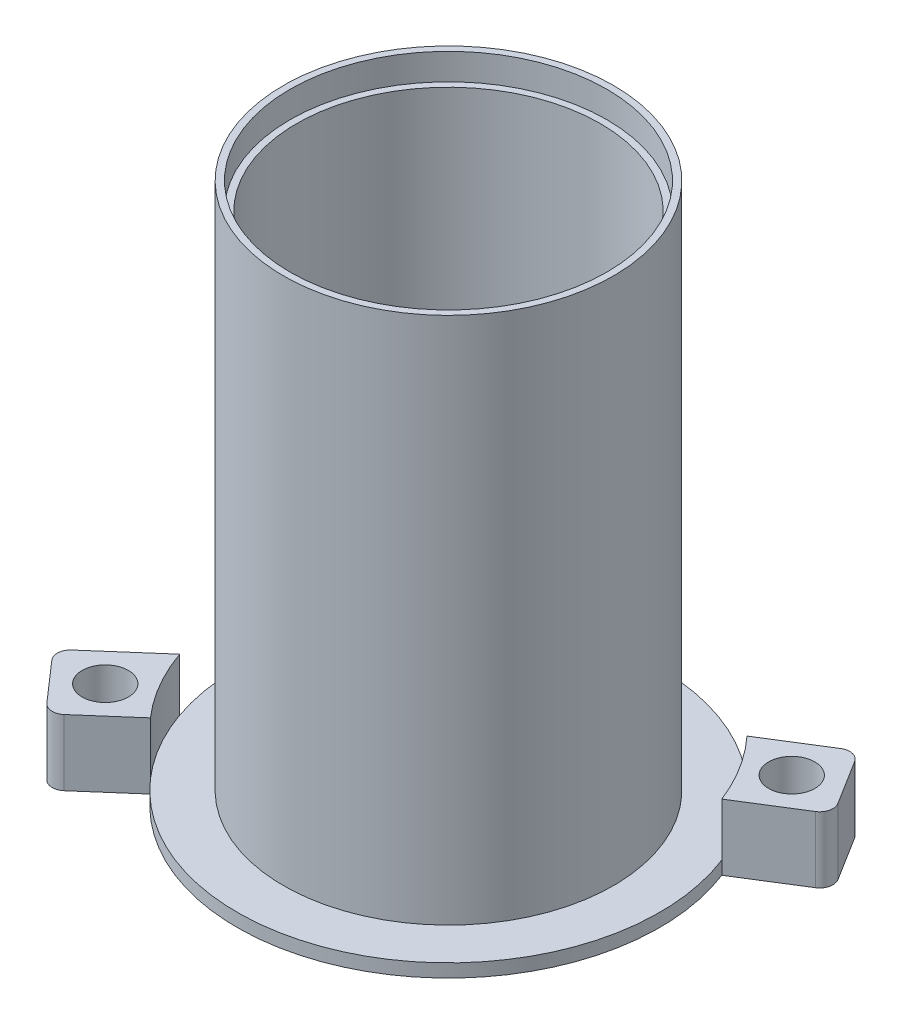
ISO-10303-21;
HEADER;
FILE_DESCRIPTION(('STEP AP214'),'2;1');
FILE_NAME('part.step','',(''),(''),'','','');
FILE_SCHEMA(('AUTOMOTIVE_DESIGN { 1 0 10303 214 1 1 1 1 }'));
ENDSEC;
DATA;
#1=APPLICATION_CONTEXT('core data for automotive mechanical design processes');
#2=APPLICATION_PROTOCOL_DEFINITION('international standard','automotive_design',2000,#1);
#3=PRODUCT_CONTEXT('',#1,'mechanical');
#4=PRODUCT('Part','Part','',(#3));
#5=PRODUCT_RELATED_PRODUCT_CATEGORY('part','',(#4));
#6=PRODUCT_DEFINITION_FORMATION('','',#4);
#7=PRODUCT_DEFINITION_CONTEXT('part definition',#1,'design');
#8=PRODUCT_DEFINITION('design','',#6,#7);
#9=PRODUCT_DEFINITION_SHAPE('','',#8);
#10=(LENGTH_UNIT() NAMED_UNIT(*) SI_UNIT(.MILLI.,.METRE.));
#11=(NAMED_UNIT(*) PLANE_ANGLE_UNIT() SI_UNIT($,.RADIAN.));
#12=(NAMED_UNIT(*) SI_UNIT($,.STERADIAN.) SOLID_ANGLE_UNIT());
#13=UNCERTAINTY_MEASURE_WITH_UNIT(LENGTH_MEASURE(1.E-05),#10,'distance_accuracy_value','');
#14=(GEOMETRIC_REPRESENTATION_CONTEXT(3) GLOBAL_UNCERTAINTY_ASSIGNED_CONTEXT((#13)) GLOBAL_UNIT_ASSIGNED_CONTEXT((#10,
#11,#12)) REPRESENTATION_CONTEXT('',''));
#15=CARTESIAN_POINT('',(0.,0.,0.));
#16=DIRECTION('',(0.,0.,1.));
#17=DIRECTION('',(1.,0.,0.));
#18=AXIS2_PLACEMENT_3D('',#15,#16,#17);
#19=CARTESIAN_POINT('',(0.,0.,0.));
#20=DIRECTION('',(0.,-1.,0.));
#21=DIRECTION('',(0.,0.,-1.));
#22=AXIS2_PLACEMENT_3D('',#19,#20,#21);
#23=CYLINDRICAL_SURFACE('',#22,16.);
#24=DIRECTION('',(0.,-1.,0.));
#25=VECTOR('',#24,1.);
#26=CARTESIAN_POINT('',(11.7373426567236,5.,-10.8735820849735));
#27=LINE('',#26,#25);
#28=CARTESIAN_POINT('',(11.7373426567236,0.999999999999999,-10.8735820849735));
#29=VERTEX_POINT('',#28);
#30=CARTESIAN_POINT('',(11.7373426567236,0.,-10.8735820849735));
#31=VERTEX_POINT('',#30);
#32=EDGE_CURVE('E164',#29,#31,#27,.T.);
#33=ORIENTED_EDGE('',*,*,#32,.T.);
#34=CARTESIAN_POINT('',(0.,0.,0.));
#35=DIRECTION('',(0.,-1.,0.));
#36=DIRECTION('',(0.,0.,-1.));
#37=AXIS2_PLACEMENT_3D('',#34,#35,#36);
#38=CIRCLE('',#37,16.);
#39=CARTESIAN_POINT('',(-15.116447524706,0.,5.24337813177819));
#40=VERTEX_POINT('',#39);
#41=EDGE_CURVE('E242',#40,#31,#38,.T.);
#42=ORIENTED_EDGE('',*,*,#41,.F.);
#43=DIRECTION('',(0.,-1.,0.));
#44=VECTOR('',#43,1.);
#45=CARTESIAN_POINT('',(-15.116447524706,5.,5.24337813177819));
#46=LINE('',#45,#44);
#47=CARTESIAN_POINT('',(-15.116447524706,0.999999999999999,5.24337813177819));
#48=VERTEX_POINT('',#47);
#49=EDGE_CURVE('E204',#48,#40,#46,.T.);
#50=ORIENTED_EDGE('',*,*,#49,.F.);
#51=CARTESIAN_POINT('',(0.,0.999999999999999,0.));
#52=DIRECTION('',(0.,-1.,0.));
#53=DIRECTION('',(0.,0.,-1.));
#54=AXIS2_PLACEMENT_3D('',#51,#52,#53);
#55=CIRCLE('',#54,16.);
#56=EDGE_CURVE('E241',#48,#29,#55,.T.);
#57=ORIENTED_EDGE('',*,*,#56,.T.);
#58=EDGE_LOOP('',(#33,#42,#50,#57));
#59=FACE_BOUND('',#58,.T.);
#60=ADVANCED_FACE('F43',(#59),#23,.T.);
#61=DIRECTION('',(0.,-1.,0.));
#62=VECTOR('',#61,1.);
#63=CARTESIAN_POINT('',(14.9173362967427,5.,-5.78559226094295));
#64=LINE('',#63,#62);
#65=CARTESIAN_POINT('',(14.9173362967427,0.999999999999999,-5.78559226094295));
#66=VERTEX_POINT('',#65);
#67=CARTESIAN_POINT('',(14.9173362967427,0.,-5.78559226094295));
#68=VERTEX_POINT('',#67);
#69=EDGE_CURVE('E155',#66,#68,#64,.T.);
#70=ORIENTED_EDGE('',*,*,#69,.F.);
#71=CARTESIAN_POINT('',(-12.0470551084564,0.999999999999999,10.5294094427852));
#72=VERTEX_POINT('',#71);
#73=EDGE_CURVE('E236',#66,#72,#55,.T.);
#74=ORIENTED_EDGE('',*,*,#73,.T.);
#75=DIRECTION('',(0.,-1.,0.));
#76=VECTOR('',#75,1.);
#77=CARTESIAN_POINT('',(-12.0470551084564,5.,10.5294094427852));
#78=LINE('',#77,#76);
#79=CARTESIAN_POINT('',(-12.0470551084564,0.,10.5294094427852));
#80=VERTEX_POINT('',#79);
#81=EDGE_CURVE('E218',#72,#80,#78,.T.);
#82=ORIENTED_EDGE('',*,*,#81,.T.);
#83=EDGE_CURVE('E240',#68,#80,#38,.T.);
#84=ORIENTED_EDGE('',*,*,#83,.F.);
#85=EDGE_LOOP('',(#70,#74,#82,#84));
#86=FACE_BOUND('',#85,.T.);
#87=ADVANCED_FACE('F316',(#86),#23,.T.);
#88=CARTESIAN_POINT('',(0.,0.,0.));
#89=DIRECTION('',(0.,-1.,0.));
#90=DIRECTION('',(0.,0.,-1.));
#91=AXIS2_PLACEMENT_3D('',#88,#89,#90);
#92=CYLINDRICAL_SURFACE('',#91,11.5);
#93=CARTESIAN_POINT('',(0.,39.,0.));
#94=DIRECTION('',(0.,-1.,0.));
#95=DIRECTION('',(0.,0.,-1.));
#96=AXIS2_PLACEMENT_3D('',#93,#94,#95);
#97=CIRCLE('',#96,11.5);
#98=CARTESIAN_POINT('',(0.,39.,-11.5));
#99=VERTEX_POINT('',#98);
#100=EDGE_CURVE('E217',#99,#99,#97,.T.);
#101=ORIENTED_EDGE('',*,*,#100,.F.);
#102=EDGE_LOOP('',(#101));
#103=FACE_BOUND('',#102,.T.);
#104=CARTESIAN_POINT('',(0.,0.,0.));
#105=DIRECTION('',(0.,-1.,0.));
#106=DIRECTION('',(0.,0.,-1.));
#107=AXIS2_PLACEMENT_3D('',#104,#105,#106);
#108=CIRCLE('',#107,11.5);
#109=CARTESIAN_POINT('',(0.,0.,-11.5));
#110=VERTEX_POINT('',#109);
#111=EDGE_CURVE('E245',#110,#110,#108,.T.);
#112=ORIENTED_EDGE('',*,*,#111,.T.);
#113=EDGE_LOOP('',(#112));
#114=FACE_BOUND('',#113,.T.);
#115=ADVANCED_FACE('F344',(#103,#114),#92,.F.);
#116=CARTESIAN_POINT('',(-11.5,0.,0.));
#117=DIRECTION('',(0.,1.,0.));
#118=DIRECTION('',(0.,0.,1.));
#119=AXIS2_PLACEMENT_3D('',#116,#117,#118);
#120=PLANE('',#119);
#121=ORIENTED_EDGE('',*,*,#111,.F.);
#122=EDGE_LOOP('',(#121));
#123=FACE_BOUND('',#122,.T.);
#124=DIRECTION('',(-0.52999894000318,0.,-0.847998304005088));
#125=VECTOR('',#124,1.);
#126=CARTESIAN_POINT('',(18.5439949120153,0.,-11.5899968200095));
#127=LINE('',#126,#125);
#128=CARTESIAN_POINT('',(19.6039927920216,0.,-9.89400021199936));
#129=VERTEX_POINT('',#128);
#130=CARTESIAN_POINT('',(17.4839970320089,0.,-13.2859934280197));
#131=VERTEX_POINT('',#130);
#132=EDGE_CURVE('E181',#129,#131,#127,.T.);
#133=ORIENTED_EDGE('',*,*,#132,.F.);
#134=CARTESIAN_POINT('',(18.7559944880165,0.,-9.36400127199618));
#135=DIRECTION('',(0.,1.,0.));
#136=DIRECTION('',(0.,0.,1.));
#137=AXIS2_PLACEMENT_3D('',#134,#135,#136);
#138=CIRCLE('',#137,1.);
#139=CARTESIAN_POINT('',(19.2859934280197,0.,-8.51600296799109));
#140=VERTEX_POINT('',#139);
#141=EDGE_CURVE('E259',#129,#140,#138,.F.);
#142=ORIENTED_EDGE('',*,*,#141,.T.);
#143=DIRECTION('',(0.847998304005088,0.,-0.52999894000318));
#144=VECTOR('',#143,1.);
#145=CARTESIAN_POINT('',(1.58999682000954,0.,2.54399491201527));
#146=LINE('',#145,#144);
#147=EDGE_CURVE('E184',#68,#140,#146,.T.);
#148=ORIENTED_EDGE('',*,*,#147,.F.);
#149=ORIENTED_EDGE('',*,*,#83,.T.);
#150=DIRECTION('',(-0.752940944278524,0.,0.658088090174077));
#151=VECTOR('',#150,1.);
#152=CARTESIAN_POINT('',(0.,0.,0.));
#153=LINE('',#152,#151);
#154=CARTESIAN_POINT('',(-15.5316176180348,0.,13.5749990131837));
#155=VERTEX_POINT('',#154);
#156=EDGE_CURVE('E194',#80,#155,#153,.T.);
#157=ORIENTED_EDGE('',*,*,#156,.T.);
#158=CARTESIAN_POINT('',(-16.1897057082089,0.,12.8220580689052));
#159=DIRECTION('',(0.,1.,0.));
#160=DIRECTION('',(0.,0.,1.));
#161=AXIS2_PLACEMENT_3D('',#158,#159,#160);
#162=CIRCLE('',#161,1.);
#163=CARTESIAN_POINT('',(-16.9426466524874,0.,13.4801461590793));
#164=VERTEX_POINT('',#163);
#165=EDGE_CURVE('E255',#155,#164,#162,.F.);
#166=ORIENTED_EDGE('',*,*,#165,.T.);
#167=DIRECTION('',(-0.658088090174077,0.,-0.752940944278524));
#168=VECTOR('',#167,1.);
#169=CARTESIAN_POINT('',(-16.2845585623133,0.,14.2330871033578));
#170=LINE('',#169,#168);
#171=CARTESIAN_POINT('',(-19.5749990131837,0.,10.4683823819652));
#172=VERTEX_POINT('',#171);
#173=EDGE_CURVE('E207',#164,#172,#170,.T.);
#174=ORIENTED_EDGE('',*,*,#173,.T.);
#175=CARTESIAN_POINT('',(-18.8220580689052,0.,9.81029429179111));
#176=DIRECTION('',(0.,1.,0.));
#177=DIRECTION('',(0.,0.,1.));
#178=AXIS2_PLACEMENT_3D('',#175,#176,#177);
#179=CIRCLE('',#178,1.);
#180=CARTESIAN_POINT('',(-19.4801461590793,0.,9.05735334751258));
#181=VERTEX_POINT('',#180);
#182=EDGE_CURVE('E253',#172,#181,#179,.F.);
#183=ORIENTED_EDGE('',*,*,#182,.T.);
#184=DIRECTION('',(0.752940944278525,0.,-0.658088090174077));
#185=VECTOR('',#184,1.);
#186=CARTESIAN_POINT('',(-3.94852854104445,0.,-4.51764566567114));
#187=LINE('',#186,#185);
#188=EDGE_CURVE('E210',#181,#40,#187,.T.);
#189=ORIENTED_EDGE('',*,*,#188,.T.);
#190=ORIENTED_EDGE('',*,*,#41,.T.);
#191=DIRECTION('',(-0.847998304005088,0.,0.52999894000318));
#192=VECTOR('',#191,1.);
#193=CARTESIAN_POINT('',(-1.58999682000954,0.,-2.54399491201527));
#194=LINE('',#193,#192);
#195=CARTESIAN_POINT('',(16.1059997880006,0.,-13.6039927920216));
#196=VERTEX_POINT('',#195);
#197=EDGE_CURVE('E179',#196,#31,#194,.T.);
#198=ORIENTED_EDGE('',*,*,#197,.F.);
#199=CARTESIAN_POINT('',(16.6359987280038,0.,-12.7559944880165));
#200=DIRECTION('',(0.,1.,0.));
#201=DIRECTION('',(0.,0.,1.));
#202=AXIS2_PLACEMENT_3D('',#199,#200,#201);
#203=CIRCLE('',#202,1.);
#204=EDGE_CURVE('E257',#196,#131,#203,.F.);
#205=ORIENTED_EDGE('',*,*,#204,.T.);
#206=EDGE_LOOP('',(#133,#142,#148,#149,#157,#166,#174,#183,#189,#190,#198,#205));
#207=FACE_BOUND('',#206,.T.);
#208=CARTESIAN_POINT('',(-16.,0.,10.));
#209=DIRECTION('',(0.,-1.,0.));
#210=DIRECTION('',(0.,0.,-1.));
#211=AXIS2_PLACEMENT_3D('',#208,#209,#210);
#212=CIRCLE('',#211,1.75);
#213=CARTESIAN_POINT('',(-16.,0.,8.25));
#214=VERTEX_POINT('',#213);
#215=EDGE_CURVE('E188',#214,#214,#212,.T.);
#216=ORIENTED_EDGE('',*,*,#215,.F.);
#217=EDGE_LOOP('',(#216));
#218=FACE_BOUND('',#217,.T.);
#219=CARTESIAN_POINT('',(16.,0.,-10.));
#220=DIRECTION('',(0.,-1.,0.));
#221=DIRECTION('',(0.,0.,-1.));
#222=AXIS2_PLACEMENT_3D('',#219,#220,#221);
#223=CIRCLE('',#222,1.75);
#224=CARTESIAN_POINT('',(16.,0.,-11.75));
#225=VERTEX_POINT('',#224);
#226=EDGE_CURVE('E176',#225,#225,#223,.T.);
#227=ORIENTED_EDGE('',*,*,#226,.F.);
#228=EDGE_LOOP('',(#227));
#229=FACE_BOUND('',#228,.T.);
#230=ADVANCED_FACE('F292',(#123,#207,#218,#229),#120,.F.);
#231=CARTESIAN_POINT('',(-16.,0.999999999999999,0.));
#232=DIRECTION('',(0.,-1.,0.));
#233=DIRECTION('',(0.,0.,-1.));
#234=AXIS2_PLACEMENT_3D('',#231,#232,#233);
#235=PLANE('',#234);
#236=EDGE_CURVE('E237',#72,#48,#55,.T.);
#237=ORIENTED_EDGE('',*,*,#236,.F.);
#238=ORIENTED_EDGE('',*,*,#73,.F.);
#239=EDGE_CURVE('E161',#29,#66,#55,.T.);
#240=ORIENTED_EDGE('',*,*,#239,.F.);
#241=ORIENTED_EDGE('',*,*,#56,.F.);
#242=EDGE_LOOP('',(#237,#238,#240,#241));
#243=FACE_BOUND('',#242,.T.);
#244=CARTESIAN_POINT('',(0.,0.999999999999999,0.));
#245=DIRECTION('',(0.,-1.,0.));
#246=DIRECTION('',(0.,0.,-1.));
#247=AXIS2_PLACEMENT_3D('',#244,#245,#246);
#248=CIRCLE('',#247,12.5);
#249=CARTESIAN_POINT('',(0.,0.999999999999999,-12.5));
#250=VERTEX_POINT('',#249);
#251=EDGE_CURVE('E233',#250,#250,#248,.T.);
#252=ORIENTED_EDGE('',*,*,#251,.T.);
#253=EDGE_LOOP('',(#252));
#254=FACE_BOUND('',#253,.T.);
#255=ADVANCED_FACE('F311',(#243,#254),#235,.F.);
#256=CARTESIAN_POINT('',(0.,0.,0.));
#257=DIRECTION('',(0.,-1.,0.));
#258=DIRECTION('',(0.,0.,-1.));
#259=AXIS2_PLACEMENT_3D('',#256,#257,#258);
#260=CYLINDRICAL_SURFACE('',#259,12.5);
#261=ORIENTED_EDGE('',*,*,#251,.F.);
#262=EDGE_LOOP('',(#261));
#263=FACE_BOUND('',#262,.T.);
#264=CARTESIAN_POINT('',(0.,41.,0.));
#265=DIRECTION('',(0.,-1.,0.));
#266=DIRECTION('',(0.,0.,-1.));
#267=AXIS2_PLACEMENT_3D('',#264,#265,#266);
#268=CIRCLE('',#267,12.5);
#269=CARTESIAN_POINT('',(0.,41.,-12.5));
#270=VERTEX_POINT('',#269);
#271=EDGE_CURVE('E230',#270,#270,#268,.T.);
#272=ORIENTED_EDGE('',*,*,#271,.T.);
#273=EDGE_LOOP('',(#272));
#274=FACE_BOUND('',#273,.T.);
#275=ADVANCED_FACE('F351',(#263,#274),#260,.T.);
#276=CARTESIAN_POINT('',(-12.5,41.,0.));
#277=DIRECTION('',(0.,-1.,0.));
#278=DIRECTION('',(0.,0.,-1.));
#279=AXIS2_PLACEMENT_3D('',#276,#277,#278);
#280=PLANE('',#279);
#281=ORIENTED_EDGE('',*,*,#271,.F.);
#282=EDGE_LOOP('',(#281));
#283=FACE_BOUND('',#282,.T.);
#284=CARTESIAN_POINT('',(0.,41.,0.));
#285=DIRECTION('',(0.,-1.,0.));
#286=DIRECTION('',(0.,0.,-1.));
#287=AXIS2_PLACEMENT_3D('',#284,#285,#286);
#288=CIRCLE('',#287,12.);
#289=CARTESIAN_POINT('',(0.,41.,-12.));
#290=VERTEX_POINT('',#289);
#291=EDGE_CURVE('E227',#290,#290,#288,.T.);
#292=ORIENTED_EDGE('',*,*,#291,.T.);
#293=EDGE_LOOP('',(#292));
#294=FACE_BOUND('',#293,.T.);
#295=ADVANCED_FACE('F366',(#283,#294),#280,.F.);
#296=CARTESIAN_POINT('',(0.,0.,0.));
#297=DIRECTION('',(0.,-1.,0.));
#298=DIRECTION('',(0.,0.,-1.));
#299=AXIS2_PLACEMENT_3D('',#296,#297,#298);
#300=CYLINDRICAL_SURFACE('',#299,12.);
#301=ORIENTED_EDGE('',*,*,#291,.F.);
#302=EDGE_LOOP('',(#301));
#303=FACE_BOUND('',#302,.T.);
#304=CARTESIAN_POINT('',(0.,39.,0.));
#305=DIRECTION('',(0.,-1.,0.));
#306=DIRECTION('',(0.,0.,-1.));
#307=AXIS2_PLACEMENT_3D('',#304,#305,#306);
#308=CIRCLE('',#307,12.);
#309=CARTESIAN_POINT('',(0.,39.,-12.));
#310=VERTEX_POINT('',#309);
#311=EDGE_CURVE('E224',#310,#310,#308,.T.);
#312=ORIENTED_EDGE('',*,*,#311,.T.);
#313=EDGE_LOOP('',(#312));
#314=FACE_BOUND('',#313,.T.);
#315=ADVANCED_FACE('F370',(#303,#314),#300,.F.);
#316=CARTESIAN_POINT('',(-12.,39.,0.));
#317=DIRECTION('',(0.,-1.,0.));
#318=DIRECTION('',(0.,0.,-1.));
#319=AXIS2_PLACEMENT_3D('',#316,#317,#318);
#320=PLANE('',#319);
#321=ORIENTED_EDGE('',*,*,#311,.F.);
#322=EDGE_LOOP('',(#321));
#323=FACE_BOUND('',#322,.T.);
#324=ORIENTED_EDGE('',*,*,#100,.T.);
#325=EDGE_LOOP('',(#324));
#326=FACE_BOUND('',#325,.T.);
#327=ADVANCED_FACE('F374',(#323,#326),#320,.F.);
#328=CARTESIAN_POINT('',(0.,5.,0.));
#329=DIRECTION('',(0.,-1.,0.));
#330=DIRECTION('',(0.,0.,-1.));
#331=AXIS2_PLACEMENT_3D('',#328,#329,#330);
#332=CYLINDRICAL_SURFACE('',#331,16.);
#333=CARTESIAN_POINT('',(-12.0470551084564,5.,10.5294094427852));
#334=VERTEX_POINT('',#333);
#335=EDGE_CURVE('E214',#334,#72,#78,.T.);
#336=ORIENTED_EDGE('',*,*,#335,.T.);
#337=ORIENTED_EDGE('',*,*,#236,.T.);
#338=CARTESIAN_POINT('',(-15.116447524706,5.,5.24337813177819));
#339=VERTEX_POINT('',#338);
#340=EDGE_CURVE('E219',#339,#48,#46,.T.);
#341=ORIENTED_EDGE('',*,*,#340,.F.);
#342=CARTESIAN_POINT('',(0.,5.,0.));
#343=DIRECTION('',(0.,-1.,0.));
#344=DIRECTION('',(0.,0.,-1.));
#345=AXIS2_PLACEMENT_3D('',#342,#343,#344);
#346=CIRCLE('',#345,16.);
#347=EDGE_CURVE('E198',#334,#339,#346,.T.);
#348=ORIENTED_EDGE('',*,*,#347,.F.);
#349=EDGE_LOOP('',(#336,#337,#341,#348));
#350=FACE_BOUND('',#349,.T.);
#351=ADVANCED_FACE('F309',(#350),#332,.F.);
#352=CARTESIAN_POINT('',(-16.2845585623133,5.,14.2330871033578));
#353=DIRECTION('',(-0.752940944278524,0.,0.658088090174077));
#354=DIRECTION('',(0.658088090174077,0.,0.752940944278524));
#355=AXIS2_PLACEMENT_3D('',#352,#353,#354);
#356=PLANE('',#355);
#357=ORIENTED_EDGE('',*,*,#173,.F.);
#358=DIRECTION('',(0.,-1.,0.));
#359=VECTOR('',#358,1.);
#360=CARTESIAN_POINT('',(-16.9426466524874,5.,13.4801461590793));
#361=LINE('',#360,#359);
#362=CARTESIAN_POINT('',(-16.9426466524874,5.,13.4801461590793));
#363=VERTEX_POINT('',#362);
#364=EDGE_CURVE('E275',#164,#363,#361,.F.);
#365=ORIENTED_EDGE('',*,*,#364,.T.);
#366=DIRECTION('',(-0.658088090174077,0.,-0.752940944278524));
#367=VECTOR('',#366,1.);
#368=CARTESIAN_POINT('',(-16.2845585623133,5.,14.2330871033578));
#369=LINE('',#368,#367);
#370=CARTESIAN_POINT('',(-19.5749990131837,5.,10.4683823819652));
#371=VERTEX_POINT('',#370);
#372=EDGE_CURVE('E193',#363,#371,#369,.T.);
#373=ORIENTED_EDGE('',*,*,#372,.T.);
#374=DIRECTION('',(0.,-1.,0.));
#375=VECTOR('',#374,1.);
#376=CARTESIAN_POINT('',(-19.5749990131837,5.,10.4683823819652));
#377=LINE('',#376,#375);
#378=EDGE_CURVE('E272',#371,#172,#377,.T.);
#379=ORIENTED_EDGE('',*,*,#378,.T.);
#380=EDGE_LOOP('',(#357,#365,#373,#379));
#381=FACE_BOUND('',#380,.T.);
#382=ADVANCED_FACE('F295',(#381),#356,.T.);
#383=CARTESIAN_POINT('',(0.,5.,0.));
#384=DIRECTION('',(0.658088090174077,0.,0.752940944278524));
#385=DIRECTION('',(0.752940944278524,0.,-0.658088090174077));
#386=AXIS2_PLACEMENT_3D('',#383,#384,#385);
#387=PLANE('',#386);
#388=DIRECTION('',(-0.752940944278524,0.,0.658088090174077));
#389=VECTOR('',#388,1.);
#390=CARTESIAN_POINT('',(0.,5.,0.));
#391=LINE('',#390,#389);
#392=CARTESIAN_POINT('',(-15.5316176180348,5.,13.5749990131837));
#393=VERTEX_POINT('',#392);
#394=EDGE_CURVE('E201',#334,#393,#391,.T.);
#395=ORIENTED_EDGE('',*,*,#394,.T.);
#396=DIRECTION('',(0.,-1.,0.));
#397=VECTOR('',#396,1.);
#398=CARTESIAN_POINT('',(-15.5316176180348,5.,13.5749990131837));
#399=LINE('',#398,#397);
#400=EDGE_CURVE('E269',#393,#155,#399,.T.);
#401=ORIENTED_EDGE('',*,*,#400,.T.);
#402=ORIENTED_EDGE('',*,*,#156,.F.);
#403=ORIENTED_EDGE('',*,*,#81,.F.);
#404=ORIENTED_EDGE('',*,*,#335,.F.);
#405=EDGE_LOOP('',(#395,#401,#402,#403,#404));
#406=FACE_BOUND('',#405,.T.);
#407=ADVANCED_FACE('F284',(#406),#387,.T.);
#408=CARTESIAN_POINT('',(-16.,5.,10.));
#409=DIRECTION('',(0.,-1.,0.));
#410=DIRECTION('',(0.,0.,-1.));
#411=AXIS2_PLACEMENT_3D('',#408,#409,#410);
#412=CYLINDRICAL_SURFACE('',#411,1.75);
#413=CARTESIAN_POINT('',(-16.,5.,10.));
#414=DIRECTION('',(0.,-1.,0.));
#415=DIRECTION('',(0.,0.,-1.));
#416=AXIS2_PLACEMENT_3D('',#413,#414,#415);
#417=CIRCLE('',#416,1.75);
#418=CARTESIAN_POINT('',(-16.,5.,8.25));
#419=VERTEX_POINT('',#418);
#420=EDGE_CURVE('E190',#419,#419,#417,.T.);
#421=ORIENTED_EDGE('',*,*,#420,.F.);
#422=EDGE_LOOP('',(#421));
#423=FACE_BOUND('',#422,.T.);
#424=ORIENTED_EDGE('',*,*,#215,.T.);
#425=EDGE_LOOP('',(#424));
#426=FACE_BOUND('',#425,.T.);
#427=ADVANCED_FACE('F378',(#423,#426),#412,.F.);
#428=CARTESIAN_POINT('',(-3.94852854104445,5.,-4.51764566567114));
#429=DIRECTION('',(-0.658088090174077,0.,-0.752940944278525));
#430=DIRECTION('',(-0.752940944278525,0.,0.658088090174077));
#431=AXIS2_PLACEMENT_3D('',#428,#429,#430);
#432=PLANE('',#431);
#433=ORIENTED_EDGE('',*,*,#188,.F.);
#434=DIRECTION('',(0.,-1.,0.));
#435=VECTOR('',#434,1.);
#436=CARTESIAN_POINT('',(-19.4801461590793,5.,9.05735334751258));
#437=LINE('',#436,#435);
#438=CARTESIAN_POINT('',(-19.4801461590793,5.,9.05735334751258));
#439=VERTEX_POINT('',#438);
#440=EDGE_CURVE('E11',#181,#439,#437,.F.);
#441=ORIENTED_EDGE('',*,*,#440,.T.);
#442=DIRECTION('',(0.752940944278525,0.,-0.658088090174077));
#443=VECTOR('',#442,1.);
#444=CARTESIAN_POINT('',(-3.94852854104445,5.,-4.51764566567114));
#445=LINE('',#444,#443);
#446=EDGE_CURVE('E196',#439,#339,#445,.T.);
#447=ORIENTED_EDGE('',*,*,#446,.T.);
#448=ORIENTED_EDGE('',*,*,#340,.T.);
#449=ORIENTED_EDGE('',*,*,#49,.T.);
#450=EDGE_LOOP('',(#433,#441,#447,#448,#449));
#451=FACE_BOUND('',#450,.T.);
#452=ADVANCED_FACE('F300',(#451),#432,.T.);
#453=CARTESIAN_POINT('',(0.,5.,0.));
#454=DIRECTION('',(0.,-1.,0.));
#455=DIRECTION('',(0.,0.,-1.));
#456=AXIS2_PLACEMENT_3D('',#453,#454,#455);
#457=PLANE('',#456);
#458=ORIENTED_EDGE('',*,*,#420,.T.);
#459=EDGE_LOOP('',(#458));
#460=FACE_BOUND('',#459,.T.);
#461=ORIENTED_EDGE('',*,*,#372,.F.);
#462=CARTESIAN_POINT('',(-16.1897057082089,5.,12.8220580689052));
#463=DIRECTION('',(0.,-1.,0.));
#464=DIRECTION('',(0.,0.,-1.));
#465=AXIS2_PLACEMENT_3D('',#462,#463,#464);
#466=CIRCLE('',#465,1.);
#467=EDGE_CURVE('E51',#363,#393,#466,.F.);
#468=ORIENTED_EDGE('',*,*,#467,.T.);
#469=ORIENTED_EDGE('',*,*,#394,.F.);
#470=ORIENTED_EDGE('',*,*,#347,.T.);
#471=ORIENTED_EDGE('',*,*,#446,.F.);
#472=CARTESIAN_POINT('',(-18.8220580689052,5.,9.81029429179111));
#473=DIRECTION('',(0.,-1.,0.));
#474=DIRECTION('',(0.,0.,-1.));
#475=AXIS2_PLACEMENT_3D('',#472,#473,#474);
#476=CIRCLE('',#475,1.);
#477=EDGE_CURVE('E63',#439,#371,#476,.F.);
#478=ORIENTED_EDGE('',*,*,#477,.T.);
#479=EDGE_LOOP('',(#461,#468,#469,#470,#471,#478));
#480=FACE_BOUND('',#479,.T.);
#481=ADVANCED_FACE('F279',(#460,#480),#457,.F.);
#482=CARTESIAN_POINT('',(0.,5.,0.));
#483=DIRECTION('',(0.,-1.,0.));
#484=DIRECTION('',(0.,0.,-1.));
#485=AXIS2_PLACEMENT_3D('',#482,#483,#484);
#486=CYLINDRICAL_SURFACE('',#485,16.);
#487=CARTESIAN_POINT('',(11.7373426567236,5.,-10.8735820849735));
#488=VERTEX_POINT('',#487);
#489=EDGE_CURVE('E187',#488,#29,#27,.T.);
#490=ORIENTED_EDGE('',*,*,#489,.T.);
#491=ORIENTED_EDGE('',*,*,#239,.T.);
#492=CARTESIAN_POINT('',(14.9173362967427,5.,-5.78559226094295));
#493=VERTEX_POINT('',#492);
#494=EDGE_CURVE('E159',#493,#66,#64,.T.);
#495=ORIENTED_EDGE('',*,*,#494,.F.);
#496=CARTESIAN_POINT('',(0.,5.,0.));
#497=DIRECTION('',(0.,-1.,0.));
#498=DIRECTION('',(0.,0.,-1.));
#499=AXIS2_PLACEMENT_3D('',#496,#497,#498);
#500=CIRCLE('',#499,16.);
#501=EDGE_CURVE('E144',#488,#493,#500,.T.);
#502=ORIENTED_EDGE('',*,*,#501,.F.);
#503=EDGE_LOOP('',(#490,#491,#495,#502));
#504=FACE_BOUND('',#503,.T.);
#505=ADVANCED_FACE('F160',(#504),#486,.F.);
#506=CARTESIAN_POINT('',(-1.58999682000954,5.,-2.54399491201527));
#507=DIRECTION('',(0.52999894000318,0.,0.847998304005088));
#508=DIRECTION('',(0.847998304005088,0.,-0.52999894000318));
#509=AXIS2_PLACEMENT_3D('',#506,#507,#508);
#510=PLANE('',#509);
#511=DIRECTION('',(-0.847998304005088,0.,0.52999894000318));
#512=VECTOR('',#511,1.);
#513=CARTESIAN_POINT('',(-1.58999682000954,5.,-2.54399491201527));
#514=LINE('',#513,#512);
#515=CARTESIAN_POINT('',(16.1059997880006,5.,-13.6039927920216));
#516=VERTEX_POINT('',#515);
#517=EDGE_CURVE('E151',#516,#488,#514,.T.);
#518=ORIENTED_EDGE('',*,*,#517,.F.);
#519=DIRECTION('',(0.,-1.,0.));
#520=VECTOR('',#519,1.);
#521=CARTESIAN_POINT('',(16.1059997880006,5.,-13.6039927920216));
#522=LINE('',#521,#520);
#523=EDGE_CURVE('E266',#516,#196,#522,.T.);
#524=ORIENTED_EDGE('',*,*,#523,.T.);
#525=ORIENTED_EDGE('',*,*,#197,.T.);
#526=ORIENTED_EDGE('',*,*,#32,.F.);
#527=ORIENTED_EDGE('',*,*,#489,.F.);
#528=EDGE_LOOP('',(#518,#524,#525,#526,#527));
#529=FACE_BOUND('',#528,.T.);
#530=ADVANCED_FACE('F331',(#529),#510,.F.);
#531=CARTESIAN_POINT('',(1.58999682000954,5.,2.54399491201527));
#532=DIRECTION('',(-0.52999894000318,0.,-0.847998304005088));
#533=DIRECTION('',(-0.847998304005088,0.,0.52999894000318));
#534=AXIS2_PLACEMENT_3D('',#531,#532,#533);
#535=PLANE('',#534);
#536=ORIENTED_EDGE('',*,*,#147,.T.);
#537=DIRECTION('',(0.,-1.,0.));
#538=VECTOR('',#537,1.);
#539=CARTESIAN_POINT('',(19.2859934280197,5.,-8.51600296799109));
#540=LINE('',#539,#538);
#541=CARTESIAN_POINT('',(19.2859934280197,5.,-8.51600296799109));
#542=VERTEX_POINT('',#541);
#543=EDGE_CURVE('E169',#140,#542,#540,.F.);
#544=ORIENTED_EDGE('',*,*,#543,.T.);
#545=DIRECTION('',(0.847998304005088,0.,-0.52999894000318));
#546=VECTOR('',#545,1.);
#547=CARTESIAN_POINT('',(1.58999682000954,5.,2.54399491201527));
#548=LINE('',#547,#546);
#549=EDGE_CURVE('E148',#493,#542,#548,.T.);
#550=ORIENTED_EDGE('',*,*,#549,.F.);
#551=ORIENTED_EDGE('',*,*,#494,.T.);
#552=ORIENTED_EDGE('',*,*,#69,.T.);
#553=EDGE_LOOP('',(#536,#544,#550,#551,#552));
#554=FACE_BOUND('',#553,.T.);
#555=ADVANCED_FACE('F167',(#554),#535,.F.);
#556=CARTESIAN_POINT('',(16.,5.,-10.));
#557=DIRECTION('',(0.,-1.,0.));
#558=DIRECTION('',(0.,0.,-1.));
#559=AXIS2_PLACEMENT_3D('',#556,#557,#558);
#560=CYLINDRICAL_SURFACE('',#559,1.75);
#561=CARTESIAN_POINT('',(16.,5.,-10.));
#562=DIRECTION('',(0.,-1.,0.));
#563=DIRECTION('',(0.,0.,-1.));
#564=AXIS2_PLACEMENT_3D('',#561,#562,#563);
#565=CIRCLE('',#564,1.75);
#566=CARTESIAN_POINT('',(16.,5.,-11.75));
#567=VERTEX_POINT('',#566);
#568=EDGE_CURVE('E186',#567,#567,#565,.T.);
#569=ORIENTED_EDGE('',*,*,#568,.F.);
#570=EDGE_LOOP('',(#569));
#571=FACE_BOUND('',#570,.T.);
#572=ORIENTED_EDGE('',*,*,#226,.T.);
#573=EDGE_LOOP('',(#572));
#574=FACE_BOUND('',#573,.T.);
#575=ADVANCED_FACE('F337',(#571,#574),#560,.F.);
#576=CARTESIAN_POINT('',(18.5439949120153,5.,-11.5899968200095));
#577=DIRECTION('',(-0.847998304005088,0.,0.52999894000318));
#578=DIRECTION('',(0.52999894000318,0.,0.847998304005088));
#579=AXIS2_PLACEMENT_3D('',#576,#577,#578);
#580=PLANE('',#579);
#581=DIRECTION('',(-0.52999894000318,0.,-0.847998304005088));
#582=VECTOR('',#581,1.);
#583=CARTESIAN_POINT('',(18.5439949120153,5.,-11.5899968200095));
#584=LINE('',#583,#582);
#585=CARTESIAN_POINT('',(19.6039927920216,5.,-9.89400021199936));
#586=VERTEX_POINT('',#585);
#587=CARTESIAN_POINT('',(17.4839970320089,5.,-13.2859934280197));
#588=VERTEX_POINT('',#587);
#589=EDGE_CURVE('E170',#586,#588,#584,.T.);
#590=ORIENTED_EDGE('',*,*,#589,.F.);
#591=DIRECTION('',(0.,-1.,0.));
#592=VECTOR('',#591,1.);
#593=CARTESIAN_POINT('',(19.6039927920216,5.,-9.89400021199936));
#594=LINE('',#593,#592);
#595=EDGE_CURVE('E250',#586,#129,#594,.T.);
#596=ORIENTED_EDGE('',*,*,#595,.T.);
#597=ORIENTED_EDGE('',*,*,#132,.T.);
#598=DIRECTION('',(0.,-1.,0.));
#599=VECTOR('',#598,1.);
#600=CARTESIAN_POINT('',(17.4839970320089,5.,-13.2859934280197));
#601=LINE('',#600,#599);
#602=EDGE_CURVE('E248',#131,#588,#601,.F.);
#603=ORIENTED_EDGE('',*,*,#602,.T.);
#604=EDGE_LOOP('',(#590,#596,#597,#603));
#605=FACE_BOUND('',#604,.T.);
#606=ADVANCED_FACE('F323',(#605),#580,.F.);
#607=CARTESIAN_POINT('',(0.,5.,0.));
#608=DIRECTION('',(0.,-1.,0.));
#609=DIRECTION('',(0.,0.,-1.));
#610=AXIS2_PLACEMENT_3D('',#607,#608,#609);
#611=PLANE('',#610);
#612=ORIENTED_EDGE('',*,*,#568,.T.);
#613=EDGE_LOOP('',(#612));
#614=FACE_BOUND('',#613,.T.);
#615=ORIENTED_EDGE('',*,*,#549,.T.);
#616=CARTESIAN_POINT('',(18.7559944880165,5.,-9.36400127199618));
#617=DIRECTION('',(0.,-1.,0.));
#618=DIRECTION('',(0.,0.,-1.));
#619=AXIS2_PLACEMENT_3D('',#616,#617,#618);
#620=CIRCLE('',#619,1.);
#621=EDGE_CURVE('E264',#542,#586,#620,.F.);
#622=ORIENTED_EDGE('',*,*,#621,.T.);
#623=ORIENTED_EDGE('',*,*,#589,.T.);
#624=CARTESIAN_POINT('',(16.6359987280038,5.,-12.7559944880165));
#625=DIRECTION('',(0.,-1.,0.));
#626=DIRECTION('',(0.,0.,-1.));
#627=AXIS2_PLACEMENT_3D('',#624,#625,#626);
#628=CIRCLE('',#627,1.);
#629=EDGE_CURVE('E262',#588,#516,#628,.F.);
#630=ORIENTED_EDGE('',*,*,#629,.T.);
#631=ORIENTED_EDGE('',*,*,#517,.T.);
#632=ORIENTED_EDGE('',*,*,#501,.T.);
#633=EDGE_LOOP('',(#615,#622,#623,#630,#631,#632));
#634=FACE_BOUND('',#633,.T.);
#635=ADVANCED_FACE('F146',(#614,#634),#611,.F.);
#636=CARTESIAN_POINT('',(18.7559944880165,5.,-9.36400127199618));
#637=DIRECTION('',(0.,-1.,0.));
#638=DIRECTION('',(0.,0.,-1.));
#639=AXIS2_PLACEMENT_3D('',#636,#637,#638);
#640=CYLINDRICAL_SURFACE('',#639,1.);
#641=ORIENTED_EDGE('',*,*,#621,.F.);
#642=ORIENTED_EDGE('',*,*,#543,.F.);
#643=ORIENTED_EDGE('',*,*,#141,.F.);
#644=ORIENTED_EDGE('',*,*,#595,.F.);
#645=EDGE_LOOP('',(#641,#642,#643,#644));
#646=FACE_BOUND('',#645,.T.);
#647=ADVANCED_FACE('F320',(#646),#640,.T.);
#648=CARTESIAN_POINT('',(16.6359987280038,5.,-12.7559944880165));
#649=DIRECTION('',(0.,-1.,0.));
#650=DIRECTION('',(0.,0.,-1.));
#651=AXIS2_PLACEMENT_3D('',#648,#649,#650);
#652=CYLINDRICAL_SURFACE('',#651,1.);
#653=ORIENTED_EDGE('',*,*,#629,.F.);
#654=ORIENTED_EDGE('',*,*,#602,.F.);
#655=ORIENTED_EDGE('',*,*,#204,.F.);
#656=ORIENTED_EDGE('',*,*,#523,.F.);
#657=EDGE_LOOP('',(#653,#654,#655,#656));
#658=FACE_BOUND('',#657,.T.);
#659=ADVANCED_FACE('F328',(#658),#652,.T.);
#660=CARTESIAN_POINT('',(-16.1897057082089,5.,12.8220580689052));
#661=DIRECTION('',(0.,-1.,0.));
#662=DIRECTION('',(0.,0.,-1.));
#663=AXIS2_PLACEMENT_3D('',#660,#661,#662);
#664=CYLINDRICAL_SURFACE('',#663,1.);
#665=ORIENTED_EDGE('',*,*,#467,.F.);
#666=ORIENTED_EDGE('',*,*,#364,.F.);
#667=ORIENTED_EDGE('',*,*,#165,.F.);
#668=ORIENTED_EDGE('',*,*,#400,.F.);
#669=EDGE_LOOP('',(#665,#666,#667,#668));
#670=FACE_BOUND('',#669,.T.);
#671=ADVANCED_FACE('F288',(#670),#664,.T.);
#672=CARTESIAN_POINT('',(-18.8220580689052,5.,9.81029429179111));
#673=DIRECTION('',(0.,-1.,0.));
#674=DIRECTION('',(0.,0.,-1.));
#675=AXIS2_PLACEMENT_3D('',#672,#673,#674);
#676=CYLINDRICAL_SURFACE('',#675,1.);
#677=ORIENTED_EDGE('',*,*,#477,.F.);
#678=ORIENTED_EDGE('',*,*,#440,.F.);
#679=ORIENTED_EDGE('',*,*,#182,.F.);
#680=ORIENTED_EDGE('',*,*,#378,.F.);
#681=EDGE_LOOP('',(#677,#678,#679,#680));
#682=FACE_BOUND('',#681,.T.);
#683=ADVANCED_FACE('F45',(#682),#676,.T.);
#684=CLOSED_SHELL('',(#60,#87,#115,#230,#255,#275,#295,#315,#327,#351,#382,#407,#427,#452,#481,
#505,#530,#555,#575,#606,#635,#647,#659,#671,#683));
#685=MANIFOLD_SOLID_BREP('B2',#684);
#686=ADVANCED_BREP_SHAPE_REPRESENTATION('',(#18,#685),#14);
#687=SHAPE_DEFINITION_REPRESENTATION(#9,#686);
ENDSEC;
END-ISO-10303-21;
